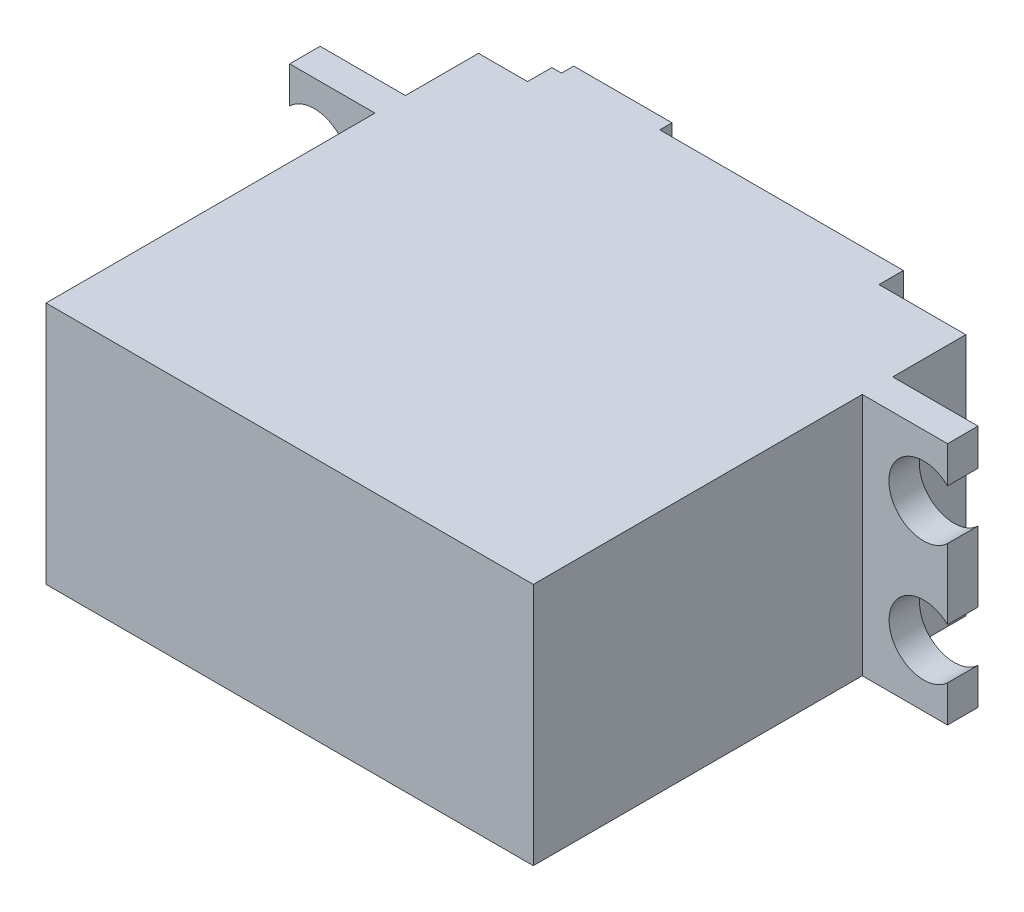
ISO-10303-21;
HEADER;
FILE_DESCRIPTION(('STEP AP214'),'2;1');
FILE_NAME('part.step','',(''),(''),'','','');
FILE_SCHEMA(('AUTOMOTIVE_DESIGN { 1 0 10303 214 1 1 1 1 }'));
ENDSEC;
DATA;
#1=APPLICATION_CONTEXT('core data for automotive mechanical design processes');
#2=APPLICATION_PROTOCOL_DEFINITION('international standard','automotive_design',2000,#1);
#3=PRODUCT_CONTEXT('',#1,'mechanical');
#4=PRODUCT('Part','Part','',(#3));
#5=PRODUCT_RELATED_PRODUCT_CATEGORY('part','',(#4));
#6=PRODUCT_DEFINITION_FORMATION('','',#4);
#7=PRODUCT_DEFINITION_CONTEXT('part definition',#1,'design');
#8=PRODUCT_DEFINITION('design','',#6,#7);
#9=PRODUCT_DEFINITION_SHAPE('','',#8);
#10=(LENGTH_UNIT() NAMED_UNIT(*) SI_UNIT(.MILLI.,.METRE.));
#11=(NAMED_UNIT(*) PLANE_ANGLE_UNIT() SI_UNIT($,.RADIAN.));
#12=(NAMED_UNIT(*) SI_UNIT($,.STERADIAN.) SOLID_ANGLE_UNIT());
#13=UNCERTAINTY_MEASURE_WITH_UNIT(LENGTH_MEASURE(1.E-05),#10,'distance_accuracy_value','');
#14=(GEOMETRIC_REPRESENTATION_CONTEXT(3) GLOBAL_UNCERTAINTY_ASSIGNED_CONTEXT((#13)) GLOBAL_UNIT_ASSIGNED_CONTEXT((#10,
#11,#12)) REPRESENTATION_CONTEXT('',''));
#15=CARTESIAN_POINT('',(0.,0.,0.));
#16=DIRECTION('',(0.,0.,1.));
#17=DIRECTION('',(1.,0.,0.));
#18=AXIS2_PLACEMENT_3D('',#15,#16,#17);
#19=CARTESIAN_POINT('',(-16.2687792845707,20.,-14.432935720393));
#20=DIRECTION('',(-1.,0.,0.));
#21=DIRECTION('',(0.,0.,1.));
#22=AXIS2_PLACEMENT_3D('',#19,#20,#21);
#23=PLANE('',#22);
#24=DIRECTION('',(0.,-1.,0.));
#25=VECTOR('',#24,1.);
#26=CARTESIAN_POINT('',(-16.2687792845707,20.,-14.432935720393));
#27=LINE('',#26,#25);
#28=CARTESIAN_POINT('',(-16.2687792845707,12.8990925603034,-14.432935720393));
#29=VERTEX_POINT('',#28);
#30=CARTESIAN_POINT('',(-16.2687792845707,7.13416909084685,-14.432935720393));
#31=VERTEX_POINT('',#30);
#32=EDGE_CURVE('E254',#29,#31,#27,.T.);
#33=ORIENTED_EDGE('',*,*,#32,.T.);
#34=DIRECTION('',(0.,0.,-1.));
#35=VECTOR('',#34,1.);
#36=CARTESIAN_POINT('',(-16.2687792845707,7.13416909084685,12.567064279607));
#37=LINE('',#36,#35);
#38=CARTESIAN_POINT('',(-16.2687792845707,7.13416909084685,-16.932935720393));
#39=VERTEX_POINT('',#38);
#40=EDGE_CURVE('E240',#31,#39,#37,.T.);
#41=ORIENTED_EDGE('',*,*,#40,.T.);
#42=DIRECTION('',(0.,-1.,0.));
#43=VECTOR('',#42,1.);
#44=CARTESIAN_POINT('',(-16.2687792845707,20.,-16.932935720393));
#45=LINE('',#44,#43);
#46=CARTESIAN_POINT('',(-16.2687792845707,12.8990925603034,-16.932935720393));
#47=VERTEX_POINT('',#46);
#48=EDGE_CURVE('E318',#47,#39,#45,.T.);
#49=ORIENTED_EDGE('',*,*,#48,.F.);
#50=DIRECTION('',(0.,0.,-1.));
#51=VECTOR('',#50,1.);
#52=CARTESIAN_POINT('',(-16.2687792845707,12.8990925603034,12.567064279607));
#53=LINE('',#52,#51);
#54=EDGE_CURVE('E56',#29,#47,#53,.T.);
#55=ORIENTED_EDGE('',*,*,#54,.F.);
#56=EDGE_LOOP('',(#33,#41,#49,#55));
#57=FACE_BOUND('',#56,.T.);
#58=ADVANCED_FACE('F34',(#57),#23,.F.);
#59=CARTESIAN_POINT('',(-23.2687792845707,20.,-14.432935720393));
#60=DIRECTION('',(0.,0.,-1.));
#61=DIRECTION('',(-1.,0.,0.));
#62=AXIS2_PLACEMENT_3D('',#59,#60,#61);
#63=PLANE('',#62);
#64=CARTESIAN_POINT('',(-16.2687792845707,3.,-14.432935720393));
#65=VERTEX_POINT('',#64);
#66=CARTESIAN_POINT('',(-16.2687792845707,0.,-14.432935720393));
#67=VERTEX_POINT('',#66);
#68=EDGE_CURVE('E256',#65,#67,#27,.T.);
#69=ORIENTED_EDGE('',*,*,#68,.F.);
#70=CARTESIAN_POINT('',(-18.222946293082,5.06708454542343,-14.432935720393));
#71=DIRECTION('',(0.,0.,-1.));
#72=DIRECTION('',(-1.,0.,0.));
#73=AXIS2_PLACEMENT_3D('',#70,#71,#72);
#74=CIRCLE('',#73,2.84457505);
#75=EDGE_CURVE('E243',#65,#31,#74,.T.);
#76=ORIENTED_EDGE('',*,*,#75,.T.);
#77=ORIENTED_EDGE('',*,*,#32,.F.);
#78=CARTESIAN_POINT('',(-18.2403894787629,14.9495462801517,-14.432935720393));
#79=DIRECTION('',(0.,0.,-1.));
#80=DIRECTION('',(-1.,0.,0.));
#81=AXIS2_PLACEMENT_3D('',#78,#79,#80);
#82=CIRCLE('',#81,2.84457505);
#83=CARTESIAN_POINT('',(-16.2687792845707,17.,-14.432935720393));
#84=VERTEX_POINT('',#83);
#85=EDGE_CURVE('E483',#84,#29,#82,.F.);
#86=ORIENTED_EDGE('',*,*,#85,.F.);
#87=CARTESIAN_POINT('',(-16.2687792845707,20.,-14.432935720393));
#88=VERTEX_POINT('',#87);
#89=EDGE_CURVE('E259',#88,#84,#27,.T.);
#90=ORIENTED_EDGE('',*,*,#89,.F.);
#91=DIRECTION('',(1.,0.,0.));
#92=VECTOR('',#91,1.);
#93=CARTESIAN_POINT('',(-23.2687792845707,20.,-14.432935720393));
#94=LINE('',#93,#92);
#95=CARTESIAN_POINT('',(-23.2687792845707,20.,-14.432935720393));
#96=VERTEX_POINT('',#95);
#97=EDGE_CURVE('E425',#96,#88,#94,.T.);
#98=ORIENTED_EDGE('',*,*,#97,.F.);
#99=DIRECTION('',(0.,-1.,0.));
#100=VECTOR('',#99,1.);
#101=CARTESIAN_POINT('',(-23.2687792845707,20.,-14.432935720393));
#102=LINE('',#101,#100);
#103=CARTESIAN_POINT('',(-23.2687792845707,0.,-14.432935720393));
#104=VERTEX_POINT('',#103);
#105=EDGE_CURVE('E262',#96,#104,#102,.T.);
#106=ORIENTED_EDGE('',*,*,#105,.T.);
#107=DIRECTION('',(1.,0.,0.));
#108=VECTOR('',#107,1.);
#109=CARTESIAN_POINT('',(-23.2687792845707,0.,-14.432935720393));
#110=LINE('',#109,#108);
#111=EDGE_CURVE('E383',#104,#67,#110,.T.);
#112=ORIENTED_EDGE('',*,*,#111,.T.);
#113=EDGE_LOOP('',(#69,#76,#77,#86,#90,#98,#106,#112));
#114=FACE_BOUND('',#113,.T.);
#115=ADVANCED_FACE('F252',(#114),#63,.F.);
#116=DIRECTION('',(0.,0.,-1.));
#117=VECTOR('',#116,1.);
#118=CARTESIAN_POINT('',(-16.2687792845707,17.,12.567064279607));
#119=LINE('',#118,#117);
#120=CARTESIAN_POINT('',(-16.2687792845707,17.,-16.932935720393));
#121=VERTEX_POINT('',#120);
#122=EDGE_CURVE('E257',#84,#121,#119,.T.);
#123=ORIENTED_EDGE('',*,*,#122,.T.);
#124=CARTESIAN_POINT('',(-16.2687792845707,20.,-16.932935720393));
#125=VERTEX_POINT('',#124);
#126=EDGE_CURVE('E263',#125,#121,#45,.T.);
#127=ORIENTED_EDGE('',*,*,#126,.F.);
#128=DIRECTION('',(0.,0.,-1.));
#129=VECTOR('',#128,1.);
#130=CARTESIAN_POINT('',(-16.2687792845707,20.,-14.432935720393));
#131=LINE('',#130,#129);
#132=EDGE_CURVE('E423',#88,#125,#131,.T.);
#133=ORIENTED_EDGE('',*,*,#132,.F.);
#134=ORIENTED_EDGE('',*,*,#89,.T.);
#135=EDGE_LOOP('',(#123,#127,#133,#134));
#136=FACE_BOUND('',#135,.T.);
#137=ADVANCED_FACE('F310',(#136),#23,.F.);
#138=CARTESIAN_POINT('',(-16.2687792845707,3.,-16.932935720393));
#139=VERTEX_POINT('',#138);
#140=CARTESIAN_POINT('',(-16.2687792845707,0.,-16.932935720393));
#141=VERTEX_POINT('',#140);
#142=EDGE_CURVE('E319',#139,#141,#45,.T.);
#143=ORIENTED_EDGE('',*,*,#142,.F.);
#144=DIRECTION('',(0.,0.,-1.));
#145=VECTOR('',#144,1.);
#146=CARTESIAN_POINT('',(-16.2687792845707,3.,12.567064279607));
#147=LINE('',#146,#145);
#148=EDGE_CURVE('E49',#65,#139,#147,.T.);
#149=ORIENTED_EDGE('',*,*,#148,.F.);
#150=ORIENTED_EDGE('',*,*,#68,.T.);
#151=DIRECTION('',(0.,0.,-1.));
#152=VECTOR('',#151,1.);
#153=CARTESIAN_POINT('',(-16.2687792845707,0.,-14.432935720393));
#154=LINE('',#153,#152);
#155=EDGE_CURVE('E381',#67,#141,#154,.T.);
#156=ORIENTED_EDGE('',*,*,#155,.T.);
#157=EDGE_LOOP('',(#143,#149,#150,#156));
#158=FACE_BOUND('',#157,.T.);
#159=ADVANCED_FACE('F504',(#158),#23,.F.);
#160=CARTESIAN_POINT('',(-16.2687792845707,20.,-16.932935720393));
#161=DIRECTION('',(0.,0.,1.));
#162=DIRECTION('',(1.,0.,0.));
#163=AXIS2_PLACEMENT_3D('',#160,#161,#162);
#164=PLANE('',#163);
#165=ORIENTED_EDGE('',*,*,#48,.T.);
#166=CARTESIAN_POINT('',(-18.222946293082,5.06708454542343,-16.932935720393));
#167=DIRECTION('',(0.,0.,1.));
#168=DIRECTION('',(1.,0.,0.));
#169=AXIS2_PLACEMENT_3D('',#166,#167,#168);
#170=CIRCLE('',#169,2.84457505);
#171=EDGE_CURVE('E11',#39,#139,#170,.T.);
#172=ORIENTED_EDGE('',*,*,#171,.T.);
#173=ORIENTED_EDGE('',*,*,#142,.T.);
#174=DIRECTION('',(-1.,0.,0.));
#175=VECTOR('',#174,1.);
#176=CARTESIAN_POINT('',(-16.2687792845707,0.,-16.932935720393));
#177=LINE('',#176,#175);
#178=CARTESIAN_POINT('',(-23.2687792845707,0.,-16.932935720393));
#179=VERTEX_POINT('',#178);
#180=EDGE_CURVE('E379',#141,#179,#177,.T.);
#181=ORIENTED_EDGE('',*,*,#180,.T.);
#182=DIRECTION('',(0.,-1.,0.));
#183=VECTOR('',#182,1.);
#184=CARTESIAN_POINT('',(-23.2687792845707,20.,-16.932935720393));
#185=LINE('',#184,#183);
#186=CARTESIAN_POINT('',(-23.2687792845707,20.,-16.932935720393));
#187=VERTEX_POINT('',#186);
#188=EDGE_CURVE('E320',#187,#179,#185,.T.);
#189=ORIENTED_EDGE('',*,*,#188,.F.);
#190=DIRECTION('',(-1.,0.,0.));
#191=VECTOR('',#190,1.);
#192=CARTESIAN_POINT('',(-16.2687792845707,20.,-16.932935720393));
#193=LINE('',#192,#191);
#194=EDGE_CURVE('E317',#125,#187,#193,.T.);
#195=ORIENTED_EDGE('',*,*,#194,.F.);
#196=ORIENTED_EDGE('',*,*,#126,.T.);
#197=CARTESIAN_POINT('',(-18.2403894787629,14.9495462801517,-16.932935720393));
#198=DIRECTION('',(0.,0.,1.));
#199=DIRECTION('',(1.,0.,0.));
#200=AXIS2_PLACEMENT_3D('',#197,#198,#199);
#201=CIRCLE('',#200,2.84457505);
#202=EDGE_CURVE('E42',#47,#121,#201,.F.);
#203=ORIENTED_EDGE('',*,*,#202,.F.);
#204=EDGE_LOOP('',(#165,#172,#173,#181,#189,#195,#196,#203));
#205=FACE_BOUND('',#204,.T.);
#206=ADVANCED_FACE('F315',(#205),#164,.F.);
#207=CARTESIAN_POINT('',(-70.2687792845707,20.,-16.932935720393));
#208=DIRECTION('',(1.,0.,0.));
#209=DIRECTION('',(0.,0.,-1.));
#210=AXIS2_PLACEMENT_3D('',#207,#208,#209);
#211=PLANE('',#210);
#212=DIRECTION('',(0.,0.,-1.));
#213=VECTOR('',#212,1.);
#214=CARTESIAN_POINT('',(-70.2687792845707,3.,12.567064279607));
#215=LINE('',#214,#213);
#216=CARTESIAN_POINT('',(-70.2687792845707,3.,-14.432935720393));
#217=VERTEX_POINT('',#216);
#218=CARTESIAN_POINT('',(-70.2687792845707,3.,-16.932935720393));
#219=VERTEX_POINT('',#218);
#220=EDGE_CURVE('E480',#217,#219,#215,.T.);
#221=ORIENTED_EDGE('',*,*,#220,.T.);
#222=DIRECTION('',(0.,-1.,0.));
#223=VECTOR('',#222,1.);
#224=CARTESIAN_POINT('',(-70.2687792845707,20.,-16.932935720393));
#225=LINE('',#224,#223);
#226=CARTESIAN_POINT('',(-70.2687792845707,0.,-16.932935720393));
#227=VERTEX_POINT('',#226);
#228=EDGE_CURVE('E282',#219,#227,#225,.T.);
#229=ORIENTED_EDGE('',*,*,#228,.T.);
#230=DIRECTION('',(0.,0.,1.));
#231=VECTOR('',#230,1.);
#232=CARTESIAN_POINT('',(-70.2687792845707,0.,-16.932935720393));
#233=LINE('',#232,#231);
#234=CARTESIAN_POINT('',(-70.2687792845707,0.,-14.432935720393));
#235=VERTEX_POINT('',#234);
#236=EDGE_CURVE('E393',#227,#235,#233,.T.);
#237=ORIENTED_EDGE('',*,*,#236,.T.);
#238=DIRECTION('',(0.,-1.,0.));
#239=VECTOR('',#238,1.);
#240=CARTESIAN_POINT('',(-70.2687792845707,20.,-14.432935720393));
#241=LINE('',#240,#239);
#242=EDGE_CURVE('E278',#217,#235,#241,.T.);
#243=ORIENTED_EDGE('',*,*,#242,.F.);
#244=EDGE_LOOP('',(#221,#229,#237,#243));
#245=FACE_BOUND('',#244,.T.);
#246=ADVANCED_FACE('F511',(#245),#211,.F.);
#247=DIRECTION('',(0.,0.,-1.));
#248=VECTOR('',#247,1.);
#249=CARTESIAN_POINT('',(-70.2687792845707,7.00403922158443,12.567064279607));
#250=LINE('',#249,#248);
#251=CARTESIAN_POINT('',(-70.2687792845707,7.00403922158443,-14.432935720393));
#252=VERTEX_POINT('',#251);
#253=CARTESIAN_POINT('',(-70.2687792845707,7.00403922158443,-16.932935720393));
#254=VERTEX_POINT('',#253);
#255=EDGE_CURVE('E479',#252,#254,#250,.T.);
#256=ORIENTED_EDGE('',*,*,#255,.F.);
#257=CARTESIAN_POINT('',(-70.2687792845707,12.9771633889391,-14.432935720393));
#258=VERTEX_POINT('',#257);
#259=EDGE_CURVE('E283',#258,#252,#241,.T.);
#260=ORIENTED_EDGE('',*,*,#259,.F.);
#261=DIRECTION('',(0.,0.,-1.));
#262=VECTOR('',#261,1.);
#263=CARTESIAN_POINT('',(-70.2687792845707,12.9771633889391,12.567064279607));
#264=LINE('',#263,#262);
#265=CARTESIAN_POINT('',(-70.2687792845707,12.9771633889391,-16.932935720393));
#266=VERTEX_POINT('',#265);
#267=EDGE_CURVE('E472',#258,#266,#264,.T.);
#268=ORIENTED_EDGE('',*,*,#267,.T.);
#269=EDGE_CURVE('E288',#266,#254,#225,.T.);
#270=ORIENTED_EDGE('',*,*,#269,.T.);
#271=EDGE_LOOP('',(#256,#260,#268,#270));
#272=FACE_BOUND('',#271,.T.);
#273=ADVANCED_FACE('F543',(#272),#211,.F.);
#274=CARTESIAN_POINT('',(-63.2687792845707,20.,-16.932935720393));
#275=DIRECTION('',(0.,0.,1.));
#276=DIRECTION('',(1.,0.,0.));
#277=AXIS2_PLACEMENT_3D('',#274,#275,#276);
#278=PLANE('',#277);
#279=CARTESIAN_POINT('',(-68.2480059937026,5.00201961079222,-16.932935720393));
#280=DIRECTION('',(0.,0.,1.));
#281=DIRECTION('',(1.,0.,0.));
#282=AXIS2_PLACEMENT_3D('',#279,#280,#281);
#283=CIRCLE('',#282,2.84457505);
#284=EDGE_CURVE('E475',#254,#219,#283,.F.);
#285=ORIENTED_EDGE('',*,*,#284,.F.);
#286=ORIENTED_EDGE('',*,*,#269,.F.);
#287=CARTESIAN_POINT('',(-68.2573609790402,14.9885816944695,-16.932935720393));
#288=DIRECTION('',(0.,0.,1.));
#289=DIRECTION('',(1.,0.,0.));
#290=AXIS2_PLACEMENT_3D('',#287,#288,#289);
#291=CIRCLE('',#290,2.84457504728671);
#292=CARTESIAN_POINT('',(-70.2687792845707,17.,-16.932935720393));
#293=VERTEX_POINT('',#292);
#294=EDGE_CURVE('E469',#266,#293,#291,.T.);
#295=ORIENTED_EDGE('',*,*,#294,.T.);
#296=CARTESIAN_POINT('',(-70.2687792845707,20.,-16.932935720393));
#297=VERTEX_POINT('',#296);
#298=EDGE_CURVE('E284',#297,#293,#225,.T.);
#299=ORIENTED_EDGE('',*,*,#298,.F.);
#300=DIRECTION('',(-1.,0.,0.));
#301=VECTOR('',#300,1.);
#302=CARTESIAN_POINT('',(-63.2687792845707,20.,-16.932935720393));
#303=LINE('',#302,#301);
#304=CARTESIAN_POINT('',(-63.2687792845707,20.,-16.932935720393));
#305=VERTEX_POINT('',#304);
#306=EDGE_CURVE('E437',#305,#297,#303,.T.);
#307=ORIENTED_EDGE('',*,*,#306,.F.);
#308=DIRECTION('',(0.,-1.,0.));
#309=VECTOR('',#308,1.);
#310=CARTESIAN_POINT('',(-63.2687792845707,20.,-16.932935720393));
#311=LINE('',#310,#309);
#312=CARTESIAN_POINT('',(-63.2687792845707,0.,-16.932935720393));
#313=VERTEX_POINT('',#312);
#314=EDGE_CURVE('E287',#305,#313,#311,.T.);
#315=ORIENTED_EDGE('',*,*,#314,.T.);
#316=DIRECTION('',(-1.,0.,0.));
#317=VECTOR('',#316,1.);
#318=CARTESIAN_POINT('',(-63.2687792845707,0.,-16.932935720393));
#319=LINE('',#318,#317);
#320=EDGE_CURVE('E396',#313,#227,#319,.T.);
#321=ORIENTED_EDGE('',*,*,#320,.T.);
#322=ORIENTED_EDGE('',*,*,#228,.F.);
#323=EDGE_LOOP('',(#285,#286,#295,#299,#307,#315,#321,#322));
#324=FACE_BOUND('',#323,.T.);
#325=ADVANCED_FACE('F537',(#324),#278,.F.);
#326=CARTESIAN_POINT('',(-70.2687792845707,20.,-14.432935720393));
#327=DIRECTION('',(0.,0.,-1.));
#328=DIRECTION('',(-1.,0.,0.));
#329=AXIS2_PLACEMENT_3D('',#326,#327,#328);
#330=PLANE('',#329);
#331=CARTESIAN_POINT('',(-68.2480059937026,5.00201961079222,-14.432935720393));
#332=DIRECTION('',(0.,0.,-1.));
#333=DIRECTION('',(-1.,0.,0.));
#334=AXIS2_PLACEMENT_3D('',#331,#332,#333);
#335=CIRCLE('',#334,2.84457505);
#336=EDGE_CURVE('E303',#217,#252,#335,.F.);
#337=ORIENTED_EDGE('',*,*,#336,.F.);
#338=ORIENTED_EDGE('',*,*,#242,.T.);
#339=DIRECTION('',(1.,0.,0.));
#340=VECTOR('',#339,1.);
#341=CARTESIAN_POINT('',(-70.2687792845707,0.,-14.432935720393));
#342=LINE('',#341,#340);
#343=CARTESIAN_POINT('',(-63.2687792845707,0.,-14.432935720393));
#344=VERTEX_POINT('',#343);
#345=EDGE_CURVE('E391',#235,#344,#342,.T.);
#346=ORIENTED_EDGE('',*,*,#345,.T.);
#347=DIRECTION('',(0.,-1.,0.));
#348=VECTOR('',#347,1.);
#349=CARTESIAN_POINT('',(-63.2687792845707,20.,-14.432935720393));
#350=LINE('',#349,#348);
#351=CARTESIAN_POINT('',(-63.2687792845707,20.,-14.432935720393));
#352=VERTEX_POINT('',#351);
#353=EDGE_CURVE('E275',#352,#344,#350,.T.);
#354=ORIENTED_EDGE('',*,*,#353,.F.);
#355=DIRECTION('',(1.,0.,0.));
#356=VECTOR('',#355,1.);
#357=CARTESIAN_POINT('',(-70.2687792845707,20.,-14.432935720393));
#358=LINE('',#357,#356);
#359=CARTESIAN_POINT('',(-70.2687792845707,20.,-14.432935720393));
#360=VERTEX_POINT('',#359);
#361=EDGE_CURVE('E433',#360,#352,#358,.T.);
#362=ORIENTED_EDGE('',*,*,#361,.F.);
#363=CARTESIAN_POINT('',(-70.2687792845707,17.,-14.432935720393));
#364=VERTEX_POINT('',#363);
#365=EDGE_CURVE('E279',#360,#364,#241,.T.);
#366=ORIENTED_EDGE('',*,*,#365,.T.);
#367=CARTESIAN_POINT('',(-68.2573609790402,14.9885816944695,-14.432935720393));
#368=DIRECTION('',(0.,0.,-1.));
#369=DIRECTION('',(-1.,0.,0.));
#370=AXIS2_PLACEMENT_3D('',#367,#368,#369);
#371=CIRCLE('',#370,2.84457504728671);
#372=EDGE_CURVE('E300',#364,#258,#371,.T.);
#373=ORIENTED_EDGE('',*,*,#372,.T.);
#374=ORIENTED_EDGE('',*,*,#259,.T.);
#375=EDGE_LOOP('',(#337,#338,#346,#354,#362,#366,#373,#374));
#376=FACE_BOUND('',#375,.T.);
#377=ADVANCED_FACE('F533',(#376),#330,.F.);
#378=CARTESIAN_POINT('',(-54.3860324873672,20.,-29.9350135612584));
#379=DIRECTION('',(0.,0.,1.));
#380=DIRECTION('',(1.,0.,0.));
#381=AXIS2_PLACEMENT_3D('',#378,#379,#380);
#382=PLANE('',#381);
#383=DIRECTION('',(0.,-1.,0.));
#384=VECTOR('',#383,1.);
#385=CARTESIAN_POINT('',(-57.3860324873672,20.,-29.9350135612584));
#386=LINE('',#385,#384);
#387=CARTESIAN_POINT('',(-57.3860324873672,13.,-29.9350135612584));
#388=VERTEX_POINT('',#387);
#389=CARTESIAN_POINT('',(-57.3860324873672,8.9277980707152,-29.9350135612584));
#390=VERTEX_POINT('',#389);
#391=EDGE_CURVE('E347',#388,#390,#386,.T.);
#392=ORIENTED_EDGE('',*,*,#391,.F.);
#393=DIRECTION('',(-1.,0.,0.));
#394=VECTOR('',#393,1.);
#395=CARTESIAN_POINT('',(-57.3860324873672,13.,-29.9350135612584));
#396=LINE('',#395,#394);
#397=CARTESIAN_POINT('',(-54.3860324873672,13.,-29.9350135612584));
#398=VERTEX_POINT('',#397);
#399=EDGE_CURVE('E462',#398,#388,#396,.T.);
#400=ORIENTED_EDGE('',*,*,#399,.F.);
#401=DIRECTION('',(0.,-1.,0.));
#402=VECTOR('',#401,1.);
#403=CARTESIAN_POINT('',(-54.3860324873672,20.,-29.9350135612584));
#404=LINE('',#403,#402);
#405=CARTESIAN_POINT('',(-54.3860324873672,8.9277980707152,-29.9350135612584));
#406=VERTEX_POINT('',#405);
#407=EDGE_CURVE('E345',#398,#406,#404,.T.);
#408=ORIENTED_EDGE('',*,*,#407,.T.);
#409=DIRECTION('',(1.,0.,0.));
#410=VECTOR('',#409,1.);
#411=CARTESIAN_POINT('',(-54.2740481895088,8.9277980707152,-29.9350135612584));
#412=LINE('',#411,#410);
#413=EDGE_CURVE('E450',#390,#406,#412,.T.);
#414=ORIENTED_EDGE('',*,*,#413,.F.);
#415=EDGE_LOOP('',(#392,#400,#408,#414));
#416=FACE_BOUND('',#415,.T.);
#417=CARTESIAN_POINT('',(-55.7951952599964,11.1021283280763,-29.9350135612584));
#418=DIRECTION('',(0.,0.,1.));
#419=DIRECTION('',(1.,0.,0.));
#420=AXIS2_PLACEMENT_3D('',#417,#418,#419);
#421=CIRCLE('',#420,1.28142203307391);
#422=CARTESIAN_POINT('',(-54.5137732269225,11.1021283280763,-29.9350135612584));
#423=VERTEX_POINT('',#422);
#424=EDGE_CURVE('E297',#423,#423,#421,.F.);
#425=ORIENTED_EDGE('',*,*,#424,.F.);
#426=EDGE_LOOP('',(#425));
#427=FACE_BOUND('',#426,.T.);
#428=ADVANCED_FACE('F536',(#416,#427),#382,.F.);
#429=CARTESIAN_POINT('',(-54.3860324873672,20.,-25.9350135612584));
#430=DIRECTION('',(-1.,0.,0.));
#431=DIRECTION('',(0.,0.,1.));
#432=AXIS2_PLACEMENT_3D('',#429,#430,#431);
#433=PLANE('',#432);
#434=ORIENTED_EDGE('',*,*,#407,.F.);
#435=DIRECTION('',(0.,0.,-1.));
#436=VECTOR('',#435,1.);
#437=CARTESIAN_POINT('',(-54.3860324873672,13.,-25.9350135612584));
#438=LINE('',#437,#436);
#439=CARTESIAN_POINT('',(-54.3860324873672,13.,-25.9350135612584));
#440=VERTEX_POINT('',#439);
#441=EDGE_CURVE('E457',#440,#398,#438,.T.);
#442=ORIENTED_EDGE('',*,*,#441,.F.);
#443=DIRECTION('',(0.,-1.,0.));
#444=VECTOR('',#443,1.);
#445=CARTESIAN_POINT('',(-54.3860324873672,20.,-25.9350135612584));
#446=LINE('',#445,#444);
#447=CARTESIAN_POINT('',(-54.3860324873672,8.9277980707152,-25.9350135612584));
#448=VERTEX_POINT('',#447);
#449=EDGE_CURVE('E343',#440,#448,#446,.T.);
#450=ORIENTED_EDGE('',*,*,#449,.T.);
#451=DIRECTION('',(0.,0.,1.));
#452=VECTOR('',#451,1.);
#453=CARTESIAN_POINT('',(-54.3860324873672,8.9277980707152,-25.9350135612584));
#454=LINE('',#453,#452);
#455=EDGE_CURVE('E406',#406,#448,#454,.T.);
#456=ORIENTED_EDGE('',*,*,#455,.F.);
#457=EDGE_LOOP('',(#434,#442,#450,#456));
#458=FACE_BOUND('',#457,.T.);
#459=ADVANCED_FACE('F621',(#458),#433,.F.);
#460=CARTESIAN_POINT('',(-57.3860324873672,20.,-29.9350135612584));
#461=DIRECTION('',(1.,0.,0.));
#462=DIRECTION('',(0.,0.,-1.));
#463=AXIS2_PLACEMENT_3D('',#460,#461,#462);
#464=PLANE('',#463);
#465=DIRECTION('',(0.,-1.,0.));
#466=VECTOR('',#465,1.);
#467=CARTESIAN_POINT('',(-57.3860324873672,20.,-25.9350135612584));
#468=LINE('',#467,#466);
#469=CARTESIAN_POINT('',(-57.3860324873672,13.,-25.9350135612584));
#470=VERTEX_POINT('',#469);
#471=CARTESIAN_POINT('',(-57.3860324873672,8.9277980707152,-25.9350135612584));
#472=VERTEX_POINT('',#471);
#473=EDGE_CURVE('E349',#470,#472,#468,.T.);
#474=ORIENTED_EDGE('',*,*,#473,.F.);
#475=DIRECTION('',(0.,0.,-1.));
#476=VECTOR('',#475,1.);
#477=CARTESIAN_POINT('',(-57.3860324873672,13.,-25.9350135612584));
#478=LINE('',#477,#476);
#479=EDGE_CURVE('E454',#470,#388,#478,.T.);
#480=ORIENTED_EDGE('',*,*,#479,.T.);
#481=ORIENTED_EDGE('',*,*,#391,.T.);
#482=DIRECTION('',(0.,0.,-1.));
#483=VECTOR('',#482,1.);
#484=CARTESIAN_POINT('',(-57.3860324873672,8.9277980707152,-29.9350135612584));
#485=LINE('',#484,#483);
#486=EDGE_CURVE('E447',#472,#390,#485,.T.);
#487=ORIENTED_EDGE('',*,*,#486,.F.);
#488=EDGE_LOOP('',(#474,#480,#481,#487));
#489=FACE_BOUND('',#488,.T.);
#490=ADVANCED_FACE('F555',(#489),#464,.F.);
#491=CARTESIAN_POINT('',(-59.2456473183431,20.,-24.932935720393));
#492=DIRECTION('',(1.,0.,0.));
#493=DIRECTION('',(0.,0.,-1.));
#494=AXIS2_PLACEMENT_3D('',#491,#492,#493);
#495=PLANE('',#494);
#496=DIRECTION('',(0.,0.,1.));
#497=VECTOR('',#496,1.);
#498=CARTESIAN_POINT('',(-59.2456473183431,0.,-24.932935720393));
#499=LINE('',#498,#497);
#500=CARTESIAN_POINT('',(-59.2456473183431,0.,-24.932935720393));
#501=VERTEX_POINT('',#500);
#502=CARTESIAN_POINT('',(-59.2456473183431,0.,-22.932935720393));
#503=VERTEX_POINT('',#502);
#504=EDGE_CURVE('E403',#501,#503,#499,.T.);
#505=ORIENTED_EDGE('',*,*,#504,.T.);
#506=DIRECTION('',(0.,-1.,0.));
#507=VECTOR('',#506,1.);
#508=CARTESIAN_POINT('',(-59.2456473183431,20.,-22.932935720393));
#509=LINE('',#508,#507);
#510=CARTESIAN_POINT('',(-59.2456473183431,20.,-22.932935720393));
#511=VERTEX_POINT('',#510);
#512=EDGE_CURVE('E294',#511,#503,#509,.T.);
#513=ORIENTED_EDGE('',*,*,#512,.F.);
#514=DIRECTION('',(0.,0.,1.));
#515=VECTOR('',#514,1.);
#516=CARTESIAN_POINT('',(-59.2456473183431,20.,-24.932935720393));
#517=LINE('',#516,#515);
#518=CARTESIAN_POINT('',(-59.2456473183431,20.,-24.932935720393));
#519=VERTEX_POINT('',#518);
#520=EDGE_CURVE('E363',#519,#511,#517,.T.);
#521=ORIENTED_EDGE('',*,*,#520,.F.);
#522=DIRECTION('',(0.,-1.,0.));
#523=VECTOR('',#522,1.);
#524=CARTESIAN_POINT('',(-59.2456473183431,20.,-24.932935720393));
#525=LINE('',#524,#523);
#526=EDGE_CURVE('E357',#519,#501,#525,.T.);
#527=ORIENTED_EDGE('',*,*,#526,.T.);
#528=EDGE_LOOP('',(#505,#513,#521,#527));
#529=FACE_BOUND('',#528,.T.);
#530=ADVANCED_FACE('F36',(#529),#495,.F.);
#531=CARTESIAN_POINT('',(-59.2456473183431,20.,-22.932935720393));
#532=DIRECTION('',(0.,0.,1.));
#533=DIRECTION('',(1.,0.,0.));
#534=AXIS2_PLACEMENT_3D('',#531,#532,#533);
#535=PLANE('',#534);
#536=DIRECTION('',(-1.,0.,0.));
#537=VECTOR('',#536,1.);
#538=CARTESIAN_POINT('',(-59.2456473183431,0.,-22.932935720393));
#539=LINE('',#538,#537);
#540=CARTESIAN_POINT('',(-63.2687792845707,0.,-22.932935720393));
#541=VERTEX_POINT('',#540);
#542=EDGE_CURVE('E401',#503,#541,#539,.T.);
#543=ORIENTED_EDGE('',*,*,#542,.T.);
#544=DIRECTION('',(0.,-1.,0.));
#545=VECTOR('',#544,1.);
#546=CARTESIAN_POINT('',(-63.2687792845707,20.,-22.932935720393));
#547=LINE('',#546,#545);
#548=CARTESIAN_POINT('',(-63.2687792845707,20.,-22.932935720393));
#549=VERTEX_POINT('',#548);
#550=EDGE_CURVE('E291',#549,#541,#547,.T.);
#551=ORIENTED_EDGE('',*,*,#550,.F.);
#552=DIRECTION('',(-1.,0.,0.));
#553=VECTOR('',#552,1.);
#554=CARTESIAN_POINT('',(-59.2456473183431,20.,-22.932935720393));
#555=LINE('',#554,#553);
#556=EDGE_CURVE('E441',#511,#549,#555,.T.);
#557=ORIENTED_EDGE('',*,*,#556,.F.);
#558=ORIENTED_EDGE('',*,*,#512,.T.);
#559=EDGE_LOOP('',(#543,#551,#557,#558));
#560=FACE_BOUND('',#559,.T.);
#561=ADVANCED_FACE('F548',(#560),#535,.F.);
#562=CARTESIAN_POINT('',(-63.2687792845707,20.,-22.932935720393));
#563=DIRECTION('',(1.,0.,0.));
#564=DIRECTION('',(0.,0.,-1.));
#565=AXIS2_PLACEMENT_3D('',#562,#563,#564);
#566=PLANE('',#565);
#567=DIRECTION('',(0.,0.,1.));
#568=VECTOR('',#567,1.);
#569=CARTESIAN_POINT('',(-63.2687792845707,0.,-22.932935720393));
#570=LINE('',#569,#568);
#571=EDGE_CURVE('E399',#541,#313,#570,.T.);
#572=ORIENTED_EDGE('',*,*,#571,.T.);
#573=ORIENTED_EDGE('',*,*,#314,.F.);
#574=DIRECTION('',(0.,0.,1.));
#575=VECTOR('',#574,1.);
#576=CARTESIAN_POINT('',(-63.2687792845707,20.,-22.932935720393));
#577=LINE('',#576,#575);
#578=EDGE_CURVE('E439',#549,#305,#577,.T.);
#579=ORIENTED_EDGE('',*,*,#578,.F.);
#580=ORIENTED_EDGE('',*,*,#550,.T.);
#581=EDGE_LOOP('',(#572,#573,#579,#580));
#582=FACE_BOUND('',#581,.T.);
#583=ADVANCED_FACE('F541',(#582),#566,.F.);
#584=ORIENTED_EDGE('',*,*,#298,.T.);
#585=DIRECTION('',(0.,0.,-1.));
#586=VECTOR('',#585,1.);
#587=CARTESIAN_POINT('',(-70.2687792845707,17.,12.567064279607));
#588=LINE('',#587,#586);
#589=EDGE_CURVE('E473',#364,#293,#588,.T.);
#590=ORIENTED_EDGE('',*,*,#589,.F.);
#591=ORIENTED_EDGE('',*,*,#365,.F.);
#592=DIRECTION('',(0.,0.,1.));
#593=VECTOR('',#592,1.);
#594=CARTESIAN_POINT('',(-70.2687792845707,20.,-16.932935720393));
#595=LINE('',#594,#593);
#596=EDGE_CURVE('E435',#297,#360,#595,.T.);
#597=ORIENTED_EDGE('',*,*,#596,.F.);
#598=EDGE_LOOP('',(#584,#590,#591,#597));
#599=FACE_BOUND('',#598,.T.);
#600=ADVANCED_FACE('F531',(#599),#211,.F.);
#601=CARTESIAN_POINT('',(-63.2687792845707,20.,-14.432935720393));
#602=DIRECTION('',(1.,0.,0.));
#603=DIRECTION('',(0.,0.,-1.));
#604=AXIS2_PLACEMENT_3D('',#601,#602,#603);
#605=PLANE('',#604);
#606=DIRECTION('',(0.,0.,1.));
#607=VECTOR('',#606,1.);
#608=CARTESIAN_POINT('',(-63.2687792845707,0.,-14.432935720393));
#609=LINE('',#608,#607);
#610=CARTESIAN_POINT('',(-63.2687792845707,0.,12.567064279607));
#611=VERTEX_POINT('',#610);
#612=EDGE_CURVE('E389',#344,#611,#609,.T.);
#613=ORIENTED_EDGE('',*,*,#612,.T.);
#614=DIRECTION('',(0.,-1.,0.));
#615=VECTOR('',#614,1.);
#616=CARTESIAN_POINT('',(-63.2687792845707,20.,12.567064279607));
#617=LINE('',#616,#615);
#618=CARTESIAN_POINT('',(-63.2687792845707,20.,12.567064279607));
#619=VERTEX_POINT('',#618);
#620=EDGE_CURVE('E272',#619,#611,#617,.T.);
#621=ORIENTED_EDGE('',*,*,#620,.F.);
#622=DIRECTION('',(0.,0.,1.));
#623=VECTOR('',#622,1.);
#624=CARTESIAN_POINT('',(-63.2687792845707,20.,-14.432935720393));
#625=LINE('',#624,#623);
#626=EDGE_CURVE('E431',#352,#619,#625,.T.);
#627=ORIENTED_EDGE('',*,*,#626,.F.);
#628=ORIENTED_EDGE('',*,*,#353,.T.);
#629=EDGE_LOOP('',(#613,#621,#627,#628));
#630=FACE_BOUND('',#629,.T.);
#631=ADVANCED_FACE('F527',(#630),#605,.F.);
#632=CARTESIAN_POINT('',(-63.2687792845707,20.,12.567064279607));
#633=DIRECTION('',(0.,0.,-1.));
#634=DIRECTION('',(-1.,0.,0.));
#635=AXIS2_PLACEMENT_3D('',#632,#633,#634);
#636=PLANE('',#635);
#637=DIRECTION('',(1.,0.,0.));
#638=VECTOR('',#637,1.);
#639=CARTESIAN_POINT('',(-63.2687792845707,0.,12.567064279607));
#640=LINE('',#639,#638);
#641=CARTESIAN_POINT('',(-23.2687792845707,0.,12.567064279607));
#642=VERTEX_POINT('',#641);
#643=EDGE_CURVE('E387',#611,#642,#640,.T.);
#644=ORIENTED_EDGE('',*,*,#643,.T.);
#645=DIRECTION('',(0.,-1.,0.));
#646=VECTOR('',#645,1.);
#647=CARTESIAN_POINT('',(-23.2687792845707,20.,12.567064279607));
#648=LINE('',#647,#646);
#649=CARTESIAN_POINT('',(-23.2687792845707,20.,12.567064279607));
#650=VERTEX_POINT('',#649);
#651=EDGE_CURVE('E269',#650,#642,#648,.T.);
#652=ORIENTED_EDGE('',*,*,#651,.F.);
#653=DIRECTION('',(1.,0.,0.));
#654=VECTOR('',#653,1.);
#655=CARTESIAN_POINT('',(-63.2687792845707,20.,12.567064279607));
#656=LINE('',#655,#654);
#657=EDGE_CURVE('E429',#619,#650,#656,.T.);
#658=ORIENTED_EDGE('',*,*,#657,.F.);
#659=ORIENTED_EDGE('',*,*,#620,.T.);
#660=EDGE_LOOP('',(#644,#652,#658,#659));
#661=FACE_BOUND('',#660,.T.);
#662=ADVANCED_FACE('F524',(#661),#636,.F.);
#663=CARTESIAN_POINT('',(-23.2687792845707,20.,12.567064279607));
#664=DIRECTION('',(-1.,0.,0.));
#665=DIRECTION('',(0.,0.,1.));
#666=AXIS2_PLACEMENT_3D('',#663,#664,#665);
#667=PLANE('',#666);
#668=DIRECTION('',(0.,0.,-1.));
#669=VECTOR('',#668,1.);
#670=CARTESIAN_POINT('',(-23.2687792845707,0.,12.567064279607));
#671=LINE('',#670,#669);
#672=EDGE_CURVE('E385',#642,#104,#671,.T.);
#673=ORIENTED_EDGE('',*,*,#672,.T.);
#674=ORIENTED_EDGE('',*,*,#105,.F.);
#675=DIRECTION('',(0.,0.,-1.));
#676=VECTOR('',#675,1.);
#677=CARTESIAN_POINT('',(-23.2687792845707,20.,12.567064279607));
#678=LINE('',#677,#676);
#679=EDGE_CURVE('E427',#650,#96,#678,.T.);
#680=ORIENTED_EDGE('',*,*,#679,.F.);
#681=ORIENTED_EDGE('',*,*,#651,.T.);
#682=EDGE_LOOP('',(#673,#674,#680,#681));
#683=FACE_BOUND('',#682,.T.);
#684=ADVANCED_FACE('F495',(#683),#667,.F.);
#685=CARTESIAN_POINT('',(-23.2687792845707,20.,-16.932935720393));
#686=DIRECTION('',(-1.,0.,0.));
#687=DIRECTION('',(0.,0.,1.));
#688=AXIS2_PLACEMENT_3D('',#685,#686,#687);
#689=PLANE('',#688);
#690=DIRECTION('',(0.,0.,-1.));
#691=VECTOR('',#690,1.);
#692=CARTESIAN_POINT('',(-23.2687792845707,0.,-16.932935720393));
#693=LINE('',#692,#691);
#694=CARTESIAN_POINT('',(-23.2687792845707,0.,-22.932935720393));
#695=VERTEX_POINT('',#694);
#696=EDGE_CURVE('E377',#179,#695,#693,.T.);
#697=ORIENTED_EDGE('',*,*,#696,.T.);
#698=DIRECTION('',(0.,-1.,0.));
#699=VECTOR('',#698,1.);
#700=CARTESIAN_POINT('',(-23.2687792845707,20.,-22.932935720393));
#701=LINE('',#700,#699);
#702=CARTESIAN_POINT('',(-23.2687792845707,20.,-22.932935720393));
#703=VERTEX_POINT('',#702);
#704=EDGE_CURVE('E324',#703,#695,#701,.T.);
#705=ORIENTED_EDGE('',*,*,#704,.F.);
#706=DIRECTION('',(0.,0.,-1.));
#707=VECTOR('',#706,1.);
#708=CARTESIAN_POINT('',(-23.2687792845707,20.,-16.932935720393));
#709=LINE('',#708,#707);
#710=EDGE_CURVE('E420',#187,#703,#709,.T.);
#711=ORIENTED_EDGE('',*,*,#710,.F.);
#712=ORIENTED_EDGE('',*,*,#188,.T.);
#713=EDGE_LOOP('',(#697,#705,#711,#712));
#714=FACE_BOUND('',#713,.T.);
#715=ADVANCED_FACE('F523',(#714),#689,.F.);
#716=CARTESIAN_POINT('',(-23.2687792845707,20.,-22.932935720393));
#717=DIRECTION('',(0.,0.,1.));
#718=DIRECTION('',(1.,0.,0.));
#719=AXIS2_PLACEMENT_3D('',#716,#717,#718);
#720=PLANE('',#719);
#721=DIRECTION('',(-1.,0.,0.));
#722=VECTOR('',#721,1.);
#723=CARTESIAN_POINT('',(-23.2687792845707,0.,-22.932935720393));
#724=LINE('',#723,#722);
#725=CARTESIAN_POINT('',(-30.3930907533027,0.,-22.932935720393));
#726=VERTEX_POINT('',#725);
#727=EDGE_CURVE('E375',#695,#726,#724,.T.);
#728=ORIENTED_EDGE('',*,*,#727,.T.);
#729=DIRECTION('',(0.,-1.,0.));
#730=VECTOR('',#729,1.);
#731=CARTESIAN_POINT('',(-30.3930907533027,20.,-22.932935720393));
#732=LINE('',#731,#730);
#733=CARTESIAN_POINT('',(-30.3930907533027,20.,-22.932935720393));
#734=VERTEX_POINT('',#733);
#735=EDGE_CURVE('E329',#734,#726,#732,.T.);
#736=ORIENTED_EDGE('',*,*,#735,.F.);
#737=DIRECTION('',(-1.,0.,0.));
#738=VECTOR('',#737,1.);
#739=CARTESIAN_POINT('',(-23.2687792845707,20.,-22.932935720393));
#740=LINE('',#739,#738);
#741=EDGE_CURVE('E418',#703,#734,#740,.T.);
#742=ORIENTED_EDGE('',*,*,#741,.F.);
#743=ORIENTED_EDGE('',*,*,#704,.T.);
#744=EDGE_LOOP('',(#728,#736,#742,#743));
#745=FACE_BOUND('',#744,.T.);
#746=ADVANCED_FACE('F606',(#745),#720,.F.);
#747=CARTESIAN_POINT('',(-30.3930907533027,20.,-22.932935720393));
#748=DIRECTION('',(-1.,0.,0.));
#749=DIRECTION('',(0.,0.,1.));
#750=AXIS2_PLACEMENT_3D('',#747,#748,#749);
#751=PLANE('',#750);
#752=DIRECTION('',(0.,0.,-1.));
#753=VECTOR('',#752,1.);
#754=CARTESIAN_POINT('',(-30.3930907533027,0.,-22.932935720393));
#755=LINE('',#754,#753);
#756=CARTESIAN_POINT('',(-30.3930907533027,0.,-24.932935720393));
#757=VERTEX_POINT('',#756);
#758=EDGE_CURVE('E373',#726,#757,#755,.T.);
#759=ORIENTED_EDGE('',*,*,#758,.T.);
#760=DIRECTION('',(0.,-1.,0.));
#761=VECTOR('',#760,1.);
#762=CARTESIAN_POINT('',(-30.3930907533027,20.,-24.932935720393));
#763=LINE('',#762,#761);
#764=CARTESIAN_POINT('',(-30.3930907533027,20.,-24.932935720393));
#765=VERTEX_POINT('',#764);
#766=EDGE_CURVE('E334',#765,#757,#763,.T.);
#767=ORIENTED_EDGE('',*,*,#766,.F.);
#768=DIRECTION('',(0.,0.,-1.));
#769=VECTOR('',#768,1.);
#770=CARTESIAN_POINT('',(-30.3930907533027,20.,-22.932935720393));
#771=LINE('',#770,#769);
#772=EDGE_CURVE('E416',#734,#765,#771,.T.);
#773=ORIENTED_EDGE('',*,*,#772,.F.);
#774=ORIENTED_EDGE('',*,*,#735,.T.);
#775=EDGE_LOOP('',(#759,#767,#773,#774));
#776=FACE_BOUND('',#775,.T.);
#777=ADVANCED_FACE('F601',(#776),#751,.F.);
#778=CARTESIAN_POINT('',(-30.3930907533027,20.,-24.932935720393));
#779=DIRECTION('',(0.,0.,1.));
#780=DIRECTION('',(1.,0.,0.));
#781=AXIS2_PLACEMENT_3D('',#778,#779,#780);
#782=PLANE('',#781);
#783=DIRECTION('',(-1.,0.,0.));
#784=VECTOR('',#783,1.);
#785=CARTESIAN_POINT('',(-30.3930907533027,0.,-24.932935720393));
#786=LINE('',#785,#784);
#787=CARTESIAN_POINT('',(-50.3860324873672,0.,-24.932935720393));
#788=VERTEX_POINT('',#787);
#789=EDGE_CURVE('E371',#757,#788,#786,.T.);
#790=ORIENTED_EDGE('',*,*,#789,.T.);
#791=DIRECTION('',(0.,-1.,0.));
#792=VECTOR('',#791,1.);
#793=CARTESIAN_POINT('',(-50.3860324873672,20.,-24.932935720393));
#794=LINE('',#793,#792);
#795=CARTESIAN_POINT('',(-50.3860324873672,20.,-24.932935720393));
#796=VERTEX_POINT('',#795);
#797=EDGE_CURVE('E337',#796,#788,#794,.T.);
#798=ORIENTED_EDGE('',*,*,#797,.F.);
#799=DIRECTION('',(-1.,0.,0.));
#800=VECTOR('',#799,1.);
#801=CARTESIAN_POINT('',(-30.3930907533027,20.,-24.932935720393));
#802=LINE('',#801,#800);
#803=EDGE_CURVE('E414',#765,#796,#802,.T.);
#804=ORIENTED_EDGE('',*,*,#803,.F.);
#805=ORIENTED_EDGE('',*,*,#766,.T.);
#806=EDGE_LOOP('',(#790,#798,#804,#805));
#807=FACE_BOUND('',#806,.T.);
#808=ADVANCED_FACE('F596',(#807),#782,.F.);
#809=CARTESIAN_POINT('',(-50.3860324873672,20.,-24.932935720393));
#810=DIRECTION('',(-1.,0.,0.));
#811=DIRECTION('',(0.,0.,1.));
#812=AXIS2_PLACEMENT_3D('',#809,#810,#811);
#813=PLANE('',#812);
#814=DIRECTION('',(0.,0.,-1.));
#815=VECTOR('',#814,1.);
#816=CARTESIAN_POINT('',(-50.3860324873672,0.,-24.932935720393));
#817=LINE('',#816,#815);
#818=CARTESIAN_POINT('',(-50.3860324873672,0.,-25.9350135612584));
#819=VERTEX_POINT('',#818);
#820=EDGE_CURVE('E368',#788,#819,#817,.T.);
#821=ORIENTED_EDGE('',*,*,#820,.T.);
#822=DIRECTION('',(0.,-1.,0.));
#823=VECTOR('',#822,1.);
#824=CARTESIAN_POINT('',(-50.3860324873672,20.,-25.9350135612584));
#825=LINE('',#824,#823);
#826=CARTESIAN_POINT('',(-50.3860324873672,20.,-25.9350135612584));
#827=VERTEX_POINT('',#826);
#828=EDGE_CURVE('E340',#827,#819,#825,.T.);
#829=ORIENTED_EDGE('',*,*,#828,.F.);
#830=DIRECTION('',(0.,0.,-1.));
#831=VECTOR('',#830,1.);
#832=CARTESIAN_POINT('',(-50.3860324873672,20.,-24.932935720393));
#833=LINE('',#832,#831);
#834=EDGE_CURVE('E412',#796,#827,#833,.T.);
#835=ORIENTED_EDGE('',*,*,#834,.F.);
#836=ORIENTED_EDGE('',*,*,#797,.T.);
#837=EDGE_LOOP('',(#821,#829,#835,#836));
#838=FACE_BOUND('',#837,.T.);
#839=ADVANCED_FACE('F591',(#838),#813,.F.);
#840=CARTESIAN_POINT('',(-57.3860324873672,20.,-25.9350135612584));
#841=DIRECTION('',(0.,0.,1.));
#842=DIRECTION('',(1.,0.,0.));
#843=AXIS2_PLACEMENT_3D('',#840,#841,#842);
#844=PLANE('',#843);
#845=ORIENTED_EDGE('',*,*,#449,.F.);
#846=DIRECTION('',(-1.,0.,0.));
#847=VECTOR('',#846,1.);
#848=CARTESIAN_POINT('',(-57.3860324873672,13.,-25.9350135612584));
#849=LINE('',#848,#847);
#850=EDGE_CURVE('E459',#440,#470,#849,.T.);
#851=ORIENTED_EDGE('',*,*,#850,.T.);
#852=ORIENTED_EDGE('',*,*,#473,.T.);
#853=DIRECTION('',(1.,0.,0.));
#854=VECTOR('',#853,1.);
#855=CARTESIAN_POINT('',(-54.2740481895088,8.9277980707152,-25.9350135612584));
#856=LINE('',#855,#854);
#857=EDGE_CURVE('E451',#472,#448,#856,.T.);
#858=ORIENTED_EDGE('',*,*,#857,.T.);
#859=EDGE_LOOP('',(#845,#851,#852,#858));
#860=FACE_BOUND('',#859,.T.);
#861=ORIENTED_EDGE('',*,*,#828,.T.);
#862=DIRECTION('',(-1.,0.,0.));
#863=VECTOR('',#862,1.);
#864=CARTESIAN_POINT('',(-57.3860324873672,0.,-25.9350135612584));
#865=LINE('',#864,#863);
#866=CARTESIAN_POINT('',(-58.4541935001841,0.,-25.9350135612584));
#867=VERTEX_POINT('',#866);
#868=EDGE_CURVE('E366',#819,#867,#865,.T.);
#869=ORIENTED_EDGE('',*,*,#868,.T.);
#870=DIRECTION('',(0.,-1.,0.));
#871=VECTOR('',#870,1.);
#872=CARTESIAN_POINT('',(-58.4541935001841,20.,-25.9350135612584));
#873=LINE('',#872,#871);
#874=CARTESIAN_POINT('',(-58.4541935001841,20.,-25.9350135612584));
#875=VERTEX_POINT('',#874);
#876=EDGE_CURVE('E351',#875,#867,#873,.T.);
#877=ORIENTED_EDGE('',*,*,#876,.F.);
#878=DIRECTION('',(-1.,0.,0.));
#879=VECTOR('',#878,1.);
#880=CARTESIAN_POINT('',(-50.3860324873672,20.,-25.9350135612584));
#881=LINE('',#880,#879);
#882=EDGE_CURVE('E410',#827,#875,#881,.T.);
#883=ORIENTED_EDGE('',*,*,#882,.F.);
#884=EDGE_LOOP('',(#861,#869,#877,#883));
#885=FACE_BOUND('',#884,.T.);
#886=ADVANCED_FACE('F586',(#860,#885),#844,.F.);
#887=CARTESIAN_POINT('',(-58.4541935001841,20.,-25.9350135612584));
#888=DIRECTION('',(1.,0.,0.));
#889=DIRECTION('',(0.,0.,-1.));
#890=AXIS2_PLACEMENT_3D('',#887,#888,#889);
#891=PLANE('',#890);
#892=DIRECTION('',(0.,0.,1.));
#893=VECTOR('',#892,1.);
#894=CARTESIAN_POINT('',(-58.4541935001841,0.,-25.9350135612584));
#895=LINE('',#894,#893);
#896=CARTESIAN_POINT('',(-58.4541935001841,0.,-24.932935720393));
#897=VERTEX_POINT('',#896);
#898=EDGE_CURVE('E364',#867,#897,#895,.T.);
#899=ORIENTED_EDGE('',*,*,#898,.T.);
#900=DIRECTION('',(0.,-1.,0.));
#901=VECTOR('',#900,1.);
#902=CARTESIAN_POINT('',(-58.4541935001841,20.,-24.932935720393));
#903=LINE('',#902,#901);
#904=CARTESIAN_POINT('',(-58.4541935001841,20.,-24.932935720393));
#905=VERTEX_POINT('',#904);
#906=EDGE_CURVE('E354',#905,#897,#903,.T.);
#907=ORIENTED_EDGE('',*,*,#906,.F.);
#908=DIRECTION('',(0.,0.,1.));
#909=VECTOR('',#908,1.);
#910=CARTESIAN_POINT('',(-58.4541935001841,20.,-25.9350135612584));
#911=LINE('',#910,#909);
#912=EDGE_CURVE('E408',#875,#905,#911,.T.);
#913=ORIENTED_EDGE('',*,*,#912,.F.);
#914=ORIENTED_EDGE('',*,*,#876,.T.);
#915=EDGE_LOOP('',(#899,#907,#913,#914));
#916=FACE_BOUND('',#915,.T.);
#917=ADVANCED_FACE('F582',(#916),#891,.F.);
#918=CARTESIAN_POINT('',(-58.4541935001841,20.,-24.932935720393));
#919=DIRECTION('',(0.,0.,1.));
#920=DIRECTION('',(1.,0.,0.));
#921=AXIS2_PLACEMENT_3D('',#918,#919,#920);
#922=PLANE('',#921);
#923=DIRECTION('',(-1.,0.,0.));
#924=VECTOR('',#923,1.);
#925=CARTESIAN_POINT('',(-58.4541935001841,0.,-24.932935720393));
#926=LINE('',#925,#924);
#927=EDGE_CURVE('E361',#897,#501,#926,.T.);
#928=ORIENTED_EDGE('',*,*,#927,.T.);
#929=ORIENTED_EDGE('',*,*,#526,.F.);
#930=DIRECTION('',(-1.,0.,0.));
#931=VECTOR('',#930,1.);
#932=CARTESIAN_POINT('',(-58.4541935001841,20.,-24.932935720393));
#933=LINE('',#932,#931);
#934=EDGE_CURVE('E360',#905,#519,#933,.T.);
#935=ORIENTED_EDGE('',*,*,#934,.F.);
#936=ORIENTED_EDGE('',*,*,#906,.T.);
#937=EDGE_LOOP('',(#928,#929,#935,#936));
#938=FACE_BOUND('',#937,.T.);
#939=ADVANCED_FACE('F578',(#938),#922,.F.);
#940=CARTESIAN_POINT('',(-59.2456473183431,20.,-22.932935720393));
#941=DIRECTION('',(0.,-1.,0.));
#942=DIRECTION('',(0.,0.,-1.));
#943=AXIS2_PLACEMENT_3D('',#940,#941,#942);
#944=PLANE('',#943);
#945=ORIENTED_EDGE('',*,*,#882,.T.);
#946=ORIENTED_EDGE('',*,*,#912,.T.);
#947=ORIENTED_EDGE('',*,*,#934,.T.);
#948=ORIENTED_EDGE('',*,*,#520,.T.);
#949=ORIENTED_EDGE('',*,*,#556,.T.);
#950=ORIENTED_EDGE('',*,*,#578,.T.);
#951=ORIENTED_EDGE('',*,*,#306,.T.);
#952=ORIENTED_EDGE('',*,*,#596,.T.);
#953=ORIENTED_EDGE('',*,*,#361,.T.);
#954=ORIENTED_EDGE('',*,*,#626,.T.);
#955=ORIENTED_EDGE('',*,*,#657,.T.);
#956=ORIENTED_EDGE('',*,*,#679,.T.);
#957=ORIENTED_EDGE('',*,*,#97,.T.);
#958=ORIENTED_EDGE('',*,*,#132,.T.);
#959=ORIENTED_EDGE('',*,*,#194,.T.);
#960=ORIENTED_EDGE('',*,*,#710,.T.);
#961=ORIENTED_EDGE('',*,*,#741,.T.);
#962=ORIENTED_EDGE('',*,*,#772,.T.);
#963=ORIENTED_EDGE('',*,*,#803,.T.);
#964=ORIENTED_EDGE('',*,*,#834,.T.);
#965=EDGE_LOOP('',(#945,#946,#947,#948,#949,#950,#951,#952,#953,#954,#955,#956,#957,#958,#959,
#960,#961,#962,#963,#964));
#966=FACE_BOUND('',#965,.T.);
#967=ADVANCED_FACE('F489',(#966),#944,.F.);
#968=CARTESIAN_POINT('',(-59.2456473183431,0.,-22.932935720393));
#969=DIRECTION('',(0.,-1.,0.));
#970=DIRECTION('',(0.,0.,-1.));
#971=AXIS2_PLACEMENT_3D('',#968,#969,#970);
#972=PLANE('',#971);
#973=ORIENTED_EDGE('',*,*,#868,.F.);
#974=ORIENTED_EDGE('',*,*,#820,.F.);
#975=ORIENTED_EDGE('',*,*,#789,.F.);
#976=ORIENTED_EDGE('',*,*,#758,.F.);
#977=ORIENTED_EDGE('',*,*,#727,.F.);
#978=ORIENTED_EDGE('',*,*,#696,.F.);
#979=ORIENTED_EDGE('',*,*,#180,.F.);
#980=ORIENTED_EDGE('',*,*,#155,.F.);
#981=ORIENTED_EDGE('',*,*,#111,.F.);
#982=ORIENTED_EDGE('',*,*,#672,.F.);
#983=ORIENTED_EDGE('',*,*,#643,.F.);
#984=ORIENTED_EDGE('',*,*,#612,.F.);
#985=ORIENTED_EDGE('',*,*,#345,.F.);
#986=ORIENTED_EDGE('',*,*,#236,.F.);
#987=ORIENTED_EDGE('',*,*,#320,.F.);
#988=ORIENTED_EDGE('',*,*,#571,.F.);
#989=ORIENTED_EDGE('',*,*,#542,.F.);
#990=ORIENTED_EDGE('',*,*,#504,.F.);
#991=ORIENTED_EDGE('',*,*,#927,.F.);
#992=ORIENTED_EDGE('',*,*,#898,.F.);
#993=EDGE_LOOP('',(#973,#974,#975,#976,#977,#978,#979,#980,#981,#982,#983,#984,#985,#986,#987,
#988,#989,#990,#991,#992));
#994=FACE_BOUND('',#993,.T.);
#995=ADVANCED_FACE('F500',(#994),#972,.T.);
#996=CARTESIAN_POINT('',(-54.2740481895088,8.9277980707152,-29.9350135612584));
#997=DIRECTION('',(0.,-1.,0.));
#998=DIRECTION('',(0.,0.,-1.));
#999=AXIS2_PLACEMENT_3D('',#996,#997,#998);
#1000=PLANE('',#999);
#1001=ORIENTED_EDGE('',*,*,#455,.T.);
#1002=ORIENTED_EDGE('',*,*,#857,.F.);
#1003=ORIENTED_EDGE('',*,*,#486,.T.);
#1004=ORIENTED_EDGE('',*,*,#413,.T.);
#1005=EDGE_LOOP('',(#1001,#1002,#1003,#1004));
#1006=FACE_BOUND('',#1005,.T.);
#1007=ADVANCED_FACE('F640',(#1006),#1000,.T.);
#1008=CARTESIAN_POINT('',(-57.3860324873672,13.,-25.9350135612584));
#1009=DIRECTION('',(0.,-1.,0.));
#1010=DIRECTION('',(0.,0.,-1.));
#1011=AXIS2_PLACEMENT_3D('',#1008,#1009,#1010);
#1012=PLANE('',#1011);
#1013=ORIENTED_EDGE('',*,*,#399,.T.);
#1014=ORIENTED_EDGE('',*,*,#479,.F.);
#1015=ORIENTED_EDGE('',*,*,#850,.F.);
#1016=ORIENTED_EDGE('',*,*,#441,.T.);
#1017=EDGE_LOOP('',(#1013,#1014,#1015,#1016));
#1018=FACE_BOUND('',#1017,.T.);
#1019=ADVANCED_FACE('F645',(#1018),#1012,.F.);
#1020=CARTESIAN_POINT('',(-55.7951952599964,11.1021283280763,-30.9350135612584));
#1021=DIRECTION('',(0.,0.,1.));
#1022=DIRECTION('',(1.,0.,0.));
#1023=AXIS2_PLACEMENT_3D('',#1020,#1021,#1022);
#1024=CYLINDRICAL_SURFACE('',#1023,1.28142203307391);
#1025=CARTESIAN_POINT('',(-55.7951952599964,11.1021283280763,-30.9350135612584));
#1026=DIRECTION('',(0.,0.,-1.));
#1027=DIRECTION('',(-1.,0.,0.));
#1028=AXIS2_PLACEMENT_3D('',#1025,#1026,#1027);
#1029=CIRCLE('',#1028,1.28142203307391);
#1030=CARTESIAN_POINT('',(-57.0766172930703,11.1021283280763,-30.9350135612584));
#1031=VERTEX_POINT('',#1030);
#1032=EDGE_CURVE('E464',#1031,#1031,#1029,.T.);
#1033=ORIENTED_EDGE('',*,*,#1032,.F.);
#1034=EDGE_LOOP('',(#1033));
#1035=FACE_BOUND('',#1034,.T.);
#1036=ORIENTED_EDGE('',*,*,#424,.T.);
#1037=EDGE_LOOP('',(#1036));
#1038=FACE_BOUND('',#1037,.T.);
#1039=ADVANCED_FACE('F649',(#1035,#1038),#1024,.T.);
#1040=CARTESIAN_POINT('',(-55.7951952599964,11.1021283280763,-30.9350135612584));
#1041=DIRECTION('',(0.,0.,-1.));
#1042=DIRECTION('',(-1.,0.,0.));
#1043=AXIS2_PLACEMENT_3D('',#1040,#1041,#1042);
#1044=PLANE('',#1043);
#1045=ORIENTED_EDGE('',*,*,#1032,.T.);
#1046=EDGE_LOOP('',(#1045));
#1047=FACE_BOUND('',#1046,.T.);
#1048=ADVANCED_FACE('F653',(#1047),#1044,.T.);
#1049=CARTESIAN_POINT('',(-68.2573609790402,14.9885816944695,12.567064279607));
#1050=DIRECTION('',(0.,0.,-1.));
#1051=DIRECTION('',(-1.,0.,0.));
#1052=AXIS2_PLACEMENT_3D('',#1049,#1050,#1051);
#1053=CYLINDRICAL_SURFACE('',#1052,2.84457504728671);
#1054=ORIENTED_EDGE('',*,*,#267,.F.);
#1055=ORIENTED_EDGE('',*,*,#372,.F.);
#1056=ORIENTED_EDGE('',*,*,#589,.T.);
#1057=ORIENTED_EDGE('',*,*,#294,.F.);
#1058=EDGE_LOOP('',(#1054,#1055,#1056,#1057));
#1059=FACE_BOUND('',#1058,.T.);
#1060=ADVANCED_FACE('F657',(#1059),#1053,.F.);
#1061=CARTESIAN_POINT('',(-68.2480059937026,5.00201961079222,12.567064279607));
#1062=DIRECTION('',(0.,0.,-1.));
#1063=DIRECTION('',(-1.,0.,0.));
#1064=AXIS2_PLACEMENT_3D('',#1061,#1062,#1063);
#1065=CYLINDRICAL_SURFACE('',#1064,2.84457505);
#1066=ORIENTED_EDGE('',*,*,#284,.T.);
#1067=ORIENTED_EDGE('',*,*,#220,.F.);
#1068=ORIENTED_EDGE('',*,*,#336,.T.);
#1069=ORIENTED_EDGE('',*,*,#255,.T.);
#1070=EDGE_LOOP('',(#1066,#1067,#1068,#1069));
#1071=FACE_BOUND('',#1070,.T.);
#1072=ADVANCED_FACE('F661',(#1071),#1065,.F.);
#1073=CARTESIAN_POINT('',(-18.2403894787629,14.9495462801517,12.567064279607));
#1074=DIRECTION('',(0.,0.,-1.));
#1075=DIRECTION('',(-1.,0.,0.));
#1076=AXIS2_PLACEMENT_3D('',#1073,#1074,#1075);
#1077=CYLINDRICAL_SURFACE('',#1076,2.84457505);
#1078=ORIENTED_EDGE('',*,*,#85,.T.);
#1079=ORIENTED_EDGE('',*,*,#54,.T.);
#1080=ORIENTED_EDGE('',*,*,#202,.T.);
#1081=ORIENTED_EDGE('',*,*,#122,.F.);
#1082=EDGE_LOOP('',(#1078,#1079,#1080,#1081));
#1083=FACE_BOUND('',#1082,.T.);
#1084=ADVANCED_FACE('F305',(#1083),#1077,.F.);
#1085=CARTESIAN_POINT('',(-18.222946293082,5.06708454542343,12.567064279607));
#1086=DIRECTION('',(0.,0.,-1.));
#1087=DIRECTION('',(-1.,0.,0.));
#1088=AXIS2_PLACEMENT_3D('',#1085,#1086,#1087);
#1089=CYLINDRICAL_SURFACE('',#1088,2.84457505);
#1090=ORIENTED_EDGE('',*,*,#148,.T.);
#1091=ORIENTED_EDGE('',*,*,#171,.F.);
#1092=ORIENTED_EDGE('',*,*,#40,.F.);
#1093=ORIENTED_EDGE('',*,*,#75,.F.);
#1094=EDGE_LOOP('',(#1090,#1091,#1092,#1093));
#1095=FACE_BOUND('',#1094,.T.);
#1096=ADVANCED_FACE('F242',(#1095),#1089,.F.);
#1097=CLOSED_SHELL('',(#58,#115,#137,#159,#206,#246,#273,#325,#377,#428,#459,#490,#530,#561,
#583,#600,#631,#662,#684,#715,#746,#777,#808,#839,#886,#917,#939,#967,#995,#1007,#1019,#1039,
#1048,#1060,#1072,#1084,#1096));
#1098=MANIFOLD_SOLID_BREP('B2',#1097);
#1099=ADVANCED_BREP_SHAPE_REPRESENTATION('',(#18,#1098),#14);
#1100=SHAPE_DEFINITION_REPRESENTATION(#9,#1099);
ENDSEC;
END-ISO-10303-21;
